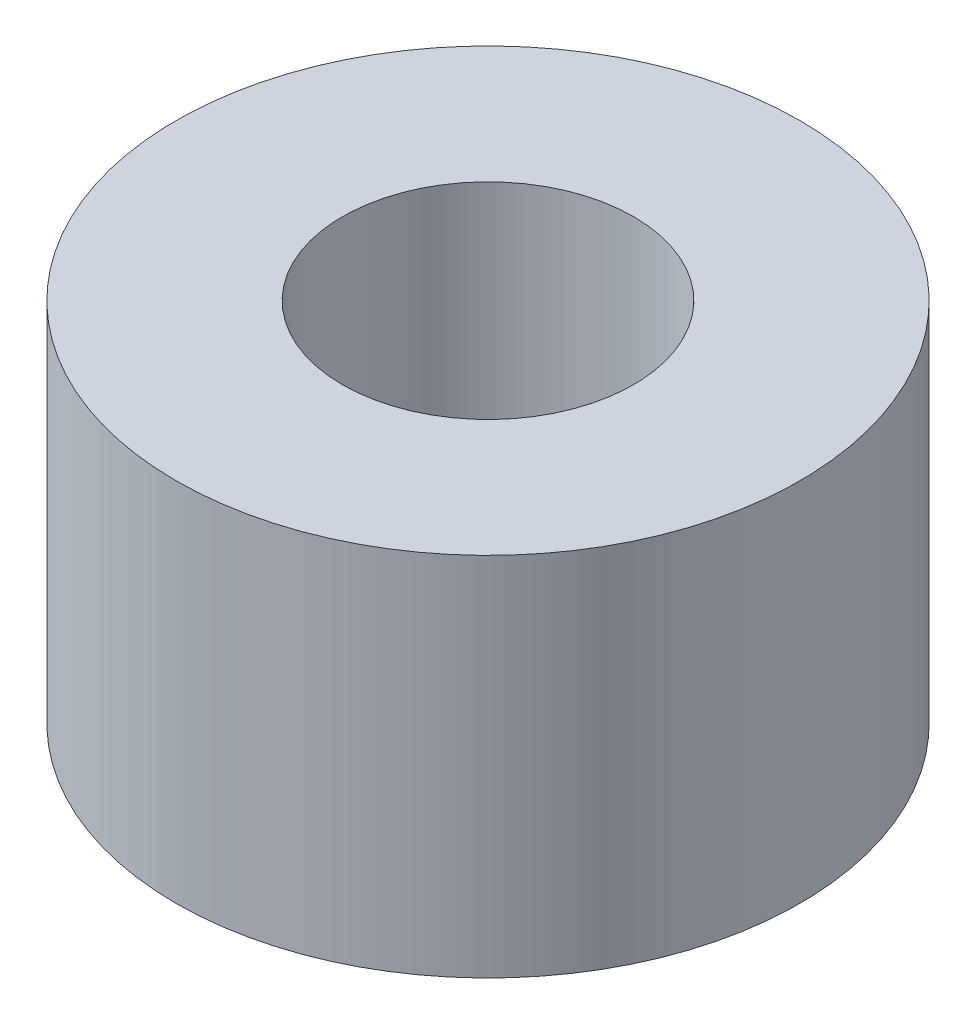
ISO-10303-21;
HEADER;
FILE_DESCRIPTION(('STEP AP214'),'2;1');
FILE_NAME('part.step','',(''),(''),'','','');
FILE_SCHEMA(('AUTOMOTIVE_DESIGN { 1 0 10303 214 1 1 1 1 }'));
ENDSEC;
DATA;
#1=APPLICATION_CONTEXT('core data for automotive mechanical design processes');
#2=APPLICATION_PROTOCOL_DEFINITION('international standard','automotive_design',2000,#1);
#3=PRODUCT_CONTEXT('',#1,'mechanical');
#4=PRODUCT('Part','Part','',(#3));
#5=PRODUCT_RELATED_PRODUCT_CATEGORY('part','',(#4));
#6=PRODUCT_DEFINITION_FORMATION('','',#4);
#7=PRODUCT_DEFINITION_CONTEXT('part definition',#1,'design');
#8=PRODUCT_DEFINITION('design','',#6,#7);
#9=PRODUCT_DEFINITION_SHAPE('','',#8);
#10=(LENGTH_UNIT() NAMED_UNIT(*) SI_UNIT(.MILLI.,.METRE.));
#11=(NAMED_UNIT(*) PLANE_ANGLE_UNIT() SI_UNIT($,.RADIAN.));
#12=(NAMED_UNIT(*) SI_UNIT($,.STERADIAN.) SOLID_ANGLE_UNIT());
#13=UNCERTAINTY_MEASURE_WITH_UNIT(LENGTH_MEASURE(1.E-05),#10,'distance_accuracy_value','');
#14=(GEOMETRIC_REPRESENTATION_CONTEXT(3) GLOBAL_UNCERTAINTY_ASSIGNED_CONTEXT((#13)) GLOBAL_UNIT_ASSIGNED_CONTEXT((#10,
#11,#12)) REPRESENTATION_CONTEXT('',''));
#15=CARTESIAN_POINT('',(0.,0.,0.));
#16=DIRECTION('',(0.,0.,1.));
#17=DIRECTION('',(1.,0.,0.));
#18=AXIS2_PLACEMENT_3D('',#15,#16,#17);
#19=CARTESIAN_POINT('',(0.,4.4,0.));
#20=DIRECTION('',(0.,1.,0.));
#21=DIRECTION('',(0.,0.,1.));
#22=AXIS2_PLACEMENT_3D('',#19,#20,#21);
#23=PLANE('',#22);
#24=CARTESIAN_POINT('',(0.,4.4,0.));
#25=DIRECTION('',(0.,1.,0.));
#26=DIRECTION('',(0.,0.,1.));
#27=AXIS2_PLACEMENT_3D('',#24,#25,#26);
#28=CIRCLE('',#27,3.75);
#29=CARTESIAN_POINT('',(0.,4.4,3.75));
#30=VERTEX_POINT('',#29);
#31=EDGE_CURVE('E10',#30,#30,#28,.T.);
#32=ORIENTED_EDGE('',*,*,#31,.T.);
#33=EDGE_LOOP('',(#32));
#34=FACE_BOUND('',#33,.T.);
#35=CARTESIAN_POINT('',(0.,4.4,0.));
#36=DIRECTION('',(0.,1.,0.));
#37=DIRECTION('',(0.,0.,1.));
#38=AXIS2_PLACEMENT_3D('',#35,#36,#37);
#39=CIRCLE('',#38,1.75);
#40=CARTESIAN_POINT('',(0.,4.4,1.75));
#41=VERTEX_POINT('',#40);
#42=EDGE_CURVE('E48',#41,#41,#39,.T.);
#43=ORIENTED_EDGE('',*,*,#42,.F.);
#44=EDGE_LOOP('',(#43));
#45=FACE_BOUND('',#44,.T.);
#46=ADVANCED_FACE('F40',(#34,#45),#23,.T.);
#47=CARTESIAN_POINT('',(0.,0.,0.));
#48=DIRECTION('',(0.,1.,0.));
#49=DIRECTION('',(0.,0.,1.));
#50=AXIS2_PLACEMENT_3D('',#47,#48,#49);
#51=PLANE('',#50);
#52=CARTESIAN_POINT('',(0.,0.,0.));
#53=DIRECTION('',(0.,1.,0.));
#54=DIRECTION('',(0.,0.,1.));
#55=AXIS2_PLACEMENT_3D('',#52,#53,#54);
#56=CIRCLE('',#55,3.75);
#57=CARTESIAN_POINT('',(0.,0.,3.75));
#58=VERTEX_POINT('',#57);
#59=EDGE_CURVE('E41',#58,#58,#56,.T.);
#60=ORIENTED_EDGE('',*,*,#59,.F.);
#61=EDGE_LOOP('',(#60));
#62=FACE_BOUND('',#61,.T.);
#63=CARTESIAN_POINT('',(0.,0.,0.));
#64=DIRECTION('',(0.,1.,0.));
#65=DIRECTION('',(0.,0.,1.));
#66=AXIS2_PLACEMENT_3D('',#63,#64,#65);
#67=CIRCLE('',#66,1.75);
#68=CARTESIAN_POINT('',(0.,0.,1.75));
#69=VERTEX_POINT('',#68);
#70=EDGE_CURVE('E49',#69,#69,#67,.T.);
#71=ORIENTED_EDGE('',*,*,#70,.T.);
#72=EDGE_LOOP('',(#71));
#73=FACE_BOUND('',#72,.T.);
#74=ADVANCED_FACE('F58',(#62,#73),#51,.F.);
#75=CARTESIAN_POINT('',(0.,4.4,0.));
#76=DIRECTION('',(0.,-1.,0.));
#77=DIRECTION('',(0.,0.,-1.));
#78=AXIS2_PLACEMENT_3D('',#75,#76,#77);
#79=CYLINDRICAL_SURFACE('',#78,3.75);
#80=ORIENTED_EDGE('',*,*,#31,.F.);
#81=EDGE_LOOP('',(#80));
#82=FACE_BOUND('',#81,.T.);
#83=ORIENTED_EDGE('',*,*,#59,.T.);
#84=EDGE_LOOP('',(#83));
#85=FACE_BOUND('',#84,.T.);
#86=ADVANCED_FACE('F39',(#82,#85),#79,.T.);
#87=CARTESIAN_POINT('',(0.,4.4,0.));
#88=DIRECTION('',(0.,-1.,0.));
#89=DIRECTION('',(0.,0.,-1.));
#90=AXIS2_PLACEMENT_3D('',#87,#88,#89);
#91=CYLINDRICAL_SURFACE('',#90,1.75);
#92=ORIENTED_EDGE('',*,*,#42,.T.);
#93=EDGE_LOOP('',(#92));
#94=FACE_BOUND('',#93,.T.);
#95=ORIENTED_EDGE('',*,*,#70,.F.);
#96=EDGE_LOOP('',(#95));
#97=FACE_BOUND('',#96,.T.);
#98=ADVANCED_FACE('F57',(#94,#97),#91,.F.);
#99=CLOSED_SHELL('',(#46,#74,#86,#98));
#100=MANIFOLD_SOLID_BREP('B2',#99);
#101=ADVANCED_BREP_SHAPE_REPRESENTATION('',(#18,#100),#14);
#102=SHAPE_DEFINITION_REPRESENTATION(#9,#101);
ENDSEC;
END-ISO-10303-21;
